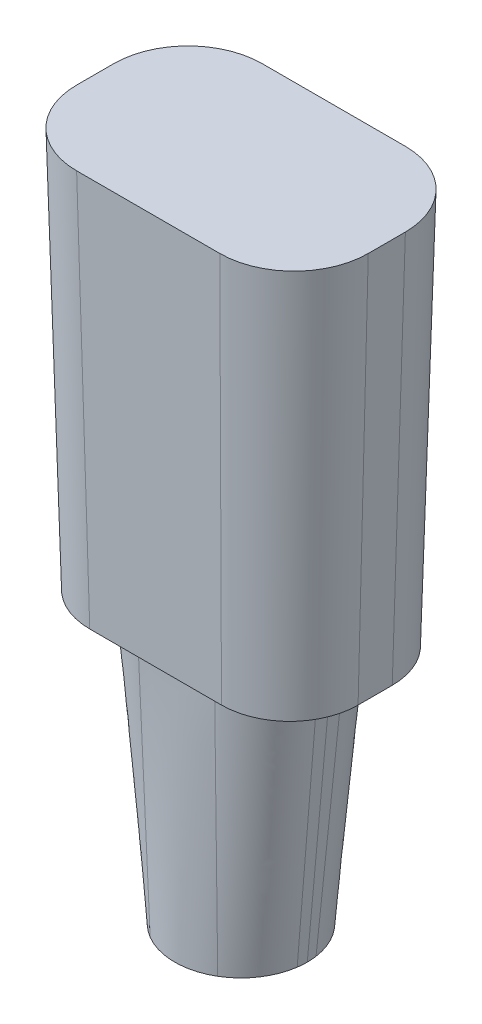
ISO-10303-21;
HEADER;
FILE_DESCRIPTION(('STEP AP214'),'2;1');
FILE_NAME('part.step','',(''),(''),'','','');
FILE_SCHEMA(('AUTOMOTIVE_DESIGN { 1 0 10303 214 1 1 1 1 }'));
ENDSEC;
DATA;
#1=APPLICATION_CONTEXT('core data for automotive mechanical design processes');
#2=APPLICATION_PROTOCOL_DEFINITION('international standard','automotive_design',2000,#1);
#3=PRODUCT_CONTEXT('',#1,'mechanical');
#4=PRODUCT('Part','Part','',(#3));
#5=PRODUCT_RELATED_PRODUCT_CATEGORY('part','',(#4));
#6=PRODUCT_DEFINITION_FORMATION('','',#4);
#7=PRODUCT_DEFINITION_CONTEXT('part definition',#1,'design');
#8=PRODUCT_DEFINITION('design','',#6,#7);
#9=PRODUCT_DEFINITION_SHAPE('','',#8);
#10=(LENGTH_UNIT() NAMED_UNIT(*) SI_UNIT(.MILLI.,.METRE.));
#11=(NAMED_UNIT(*) PLANE_ANGLE_UNIT() SI_UNIT($,.RADIAN.));
#12=(NAMED_UNIT(*) SI_UNIT($,.STERADIAN.) SOLID_ANGLE_UNIT());
#13=UNCERTAINTY_MEASURE_WITH_UNIT(LENGTH_MEASURE(1.E-05),#10,'distance_accuracy_value','');
#14=(GEOMETRIC_REPRESENTATION_CONTEXT(3) GLOBAL_UNCERTAINTY_ASSIGNED_CONTEXT((#13)) GLOBAL_UNIT_ASSIGNED_CONTEXT((#10,
#11,#12)) REPRESENTATION_CONTEXT('',''));
#15=CARTESIAN_POINT('',(0.,0.,0.));
#16=DIRECTION('',(0.,0.,1.));
#17=DIRECTION('',(1.,0.,0.));
#18=AXIS2_PLACEMENT_3D('',#15,#16,#17);
#19=CARTESIAN_POINT('',(-163.,-89.,410.));
#20=DIRECTION('',(0.,-1.,0.));
#21=DIRECTION('',(0.,0.,-1.));
#22=AXIS2_PLACEMENT_3D('',#19,#20,#21);
#23=PLANE('',#22);
#24=CARTESIAN_POINT('',(-163.,-89.,410.));
#25=DIRECTION('',(0.,-1.,0.));
#26=DIRECTION('',(1.,0.,0.));
#27=AXIS2_PLACEMENT_3D('',#24,#25,#26);
#28=CIRCLE('',#27,2.5);
#29=CARTESIAN_POINT('',(-165.4745826264,-89.,410.35558518678));
#30=VERTEX_POINT('',#29);
#31=CARTESIAN_POINT('',(-165.4745826264,-89.,409.64441481321));
#32=VERTEX_POINT('',#31);
#33=EDGE_CURVE('E229',#30,#32,#28,.T.);
#34=ORIENTED_EDGE('',*,*,#33,.T.);
#35=CARTESIAN_POINT('',(-163.,-89.,410.));
#36=DIRECTION('',(0.,-1.,0.));
#37=DIRECTION('',(1.,0.,0.));
#38=AXIS2_PLACEMENT_3D('',#35,#36,#37);
#39=CIRCLE('',#38,2.5);
#40=CARTESIAN_POINT('',(-164.2733022347,-89.,407.84855829294));
#41=VERTEX_POINT('',#40);
#42=EDGE_CURVE('E10',#32,#41,#39,.T.);
#43=ORIENTED_EDGE('',*,*,#42,.T.);
#44=CARTESIAN_POINT('',(-163.,-89.,410.));
#45=DIRECTION('',(0.,-1.,0.));
#46=DIRECTION('',(1.,0.,0.));
#47=AXIS2_PLACEMENT_3D('',#44,#45,#46);
#48=CIRCLE('',#47,2.5);
#49=CARTESIAN_POINT('',(-161.7266977652,-89.,407.84855829294));
#50=VERTEX_POINT('',#49);
#51=EDGE_CURVE('E200',#41,#50,#48,.T.);
#52=ORIENTED_EDGE('',*,*,#51,.T.);
#53=CARTESIAN_POINT('',(-163.,-89.,410.));
#54=DIRECTION('',(0.,-1.,0.));
#55=DIRECTION('',(1.,0.,0.));
#56=AXIS2_PLACEMENT_3D('',#53,#54,#55);
#57=CIRCLE('',#56,2.5);
#58=CARTESIAN_POINT('',(-160.5254173735,-89.,409.64441481321));
#59=VERTEX_POINT('',#58);
#60=EDGE_CURVE('E358',#50,#59,#57,.T.);
#61=ORIENTED_EDGE('',*,*,#60,.T.);
#62=CARTESIAN_POINT('',(-163.,-89.,410.));
#63=DIRECTION('',(0.,-1.,0.));
#64=DIRECTION('',(1.,0.,0.));
#65=AXIS2_PLACEMENT_3D('',#62,#63,#64);
#66=CIRCLE('',#65,2.5);
#67=CARTESIAN_POINT('',(-160.5,-89.,410.));
#68=VERTEX_POINT('',#67);
#69=EDGE_CURVE('E429',#59,#68,#66,.T.);
#70=ORIENTED_EDGE('',*,*,#69,.T.);
#71=CARTESIAN_POINT('',(-163.,-89.,410.));
#72=DIRECTION('',(0.,-1.,0.));
#73=DIRECTION('',(1.,0.,0.));
#74=AXIS2_PLACEMENT_3D('',#71,#72,#73);
#75=CIRCLE('',#74,2.5);
#76=CARTESIAN_POINT('',(-160.5254173735,-89.,410.35558518678));
#77=VERTEX_POINT('',#76);
#78=EDGE_CURVE('E248',#68,#77,#75,.T.);
#79=ORIENTED_EDGE('',*,*,#78,.T.);
#80=CARTESIAN_POINT('',(-163.,-89.,410.));
#81=DIRECTION('',(0.,-1.,0.));
#82=DIRECTION('',(1.,0.,0.));
#83=AXIS2_PLACEMENT_3D('',#80,#81,#82);
#84=CIRCLE('',#83,2.5);
#85=CARTESIAN_POINT('',(-161.7266977652,-89.,412.15144170706));
#86=VERTEX_POINT('',#85);
#87=EDGE_CURVE('E249',#77,#86,#84,.T.);
#88=ORIENTED_EDGE('',*,*,#87,.T.);
#89=CARTESIAN_POINT('',(-163.,-89.,410.));
#90=DIRECTION('',(0.,-1.,0.));
#91=DIRECTION('',(1.,0.,0.));
#92=AXIS2_PLACEMENT_3D('',#89,#90,#91);
#93=CIRCLE('',#92,2.5);
#94=CARTESIAN_POINT('',(-164.2733022347,-89.,412.15144170706));
#95=VERTEX_POINT('',#94);
#96=EDGE_CURVE('E295',#86,#95,#93,.T.);
#97=ORIENTED_EDGE('',*,*,#96,.T.);
#98=CARTESIAN_POINT('',(-163.,-89.,410.));
#99=DIRECTION('',(0.,-1.,0.));
#100=DIRECTION('',(1.,0.,0.));
#101=AXIS2_PLACEMENT_3D('',#98,#99,#100);
#102=CIRCLE('',#101,2.5);
#103=EDGE_CURVE('E309',#95,#30,#102,.T.);
#104=ORIENTED_EDGE('',*,*,#103,.T.);
#105=EDGE_LOOP('',(#34,#43,#52,#61,#70,#79,#88,#97,#104));
#106=FACE_BOUND('',#105,.T.);
#107=ADVANCED_FACE('F15',(#106),#23,.T.);
#108=CARTESIAN_POINT('',(-166.41,-79.,409.51));
#109=CARTESIAN_POINT('',(-165.4745826264,-89.,409.64441481321));
#110=CARTESIAN_POINT('',(-166.41,-79.,409.12515489993));
#111=CARTESIAN_POINT('',(-165.4348600817,-89.,409.36797832885));
#112=CARTESIAN_POINT('',(-166.3236408536,-79.,408.74030967873));
#113=CARTESIAN_POINT('',(-165.3598455751,-89.,409.09661383883));
#114=CARTESIAN_POINT('',(-166.1509234091,-78.99999999999,408.3780740607));
#115=CARTESIAN_POINT('',(-165.2502926811,-89.,408.83557498516));
#116=CARTESIAN_POINT('',(-165.8989471613,-79.,408.06105283867));
#117=CARTESIAN_POINT('',(-165.1078991538,-89.,408.58998873659));
#118=CARTESIAN_POINT('',(-165.5819259392,-78.99999999999,407.80907659089));
#119=CARTESIAN_POINT('',(-164.9352683538,-89.,408.36462873794));
#120=CARTESIAN_POINT('',(-165.2196903212,-79.,407.63635914636));
#121=CARTESIAN_POINT('',(-164.7358186128,-89.,408.1637234854));
#122=CARTESIAN_POINT('',(-164.8348451,-79.,407.55));
#123=CARTESIAN_POINT('',(-164.5136405348,-89.,407.99079932767));
#124=CARTESIAN_POINT('',(-164.45,-79.,407.55));
#125=CARTESIAN_POINT('',(-164.2733022347,-89.,407.84855829294));
#126=(BOUNDED_SURFACE() B_SPLINE_SURFACE(8,1,((#108,#109),(#110,#111),(#112,#113),(#114,#115),
(#116,#117),(#118,#119),(#120,#121),(#122,#123),(#124,#125)),.UNSPECIFIED.,.F.,.F.,
.F.) B_SPLINE_SURFACE_WITH_KNOTS((9,9),(2,2),(3.14159265359,4.712388980385),(0.,1.),
.UNSPECIFIED.) GEOMETRIC_REPRESENTATION_ITEM() RATIONAL_B_SPLINE_SURFACE(((1.,1.),(1.,1.),(1.,
1.),(1.,1.),(1.,1.),(1.,1.),(1.,1.),(1.,1.),(1.,1.))) REPRESENTATION_ITEM('') SURFACE());
#127=CARTESIAN_POINT('',(-164.45,-79.,409.51));
#128=DIRECTION('',(0.,-1.,0.));
#129=DIRECTION('',(1.,0.,0.));
#130=AXIS2_PLACEMENT_3D('',#127,#128,#129);
#131=CIRCLE('',#130,1.96);
#132=CARTESIAN_POINT('',(-166.41,-79.,409.51));
#133=VERTEX_POINT('',#132);
#134=CARTESIAN_POINT('',(-164.45,-79.,407.55));
#135=VERTEX_POINT('',#134);
#136=EDGE_CURVE('E263',#133,#135,#131,.T.);
#137=CARTESIAN_POINT('',(-164.45,-79.,407.55));
#138=CARTESIAN_POINT('',(-164.2733022347,-89.,407.84855829294));
#139=(BOUNDED_CURVE() B_SPLINE_CURVE(1,(#137,#138),.UNSPECIFIED.,.F.,
.F.) B_SPLINE_CURVE_WITH_KNOTS((2,2),(0.,1.),
.UNSPECIFIED.) CURVE() GEOMETRIC_REPRESENTATION_ITEM() RATIONAL_B_SPLINE_CURVE((1.,1.)) REPRESENTATION_ITEM(''));
#140=EDGE_CURVE('E30',#135,#41,#139,.T.);
#141=CARTESIAN_POINT('',(-166.41,-79.,409.51));
#142=CARTESIAN_POINT('',(-165.4745826264,-89.,409.64441481321));
#143=(BOUNDED_CURVE() B_SPLINE_CURVE(1,(#141,#142),.UNSPECIFIED.,.F.,
.F.) B_SPLINE_CURVE_WITH_KNOTS((2,2),(0.,1.),
.UNSPECIFIED.) CURVE() GEOMETRIC_REPRESENTATION_ITEM() RATIONAL_B_SPLINE_CURVE((1.,1.)) REPRESENTATION_ITEM(''));
#144=EDGE_CURVE('E208',#133,#32,#143,.T.);
#145=ORIENTED_EDGE('',*,*,#136,.T.);
#146=ORIENTED_EDGE('',*,*,#140,.T.);
#147=ORIENTED_EDGE('',*,*,#42,.F.);
#148=ORIENTED_EDGE('',*,*,#144,.F.);
#149=EDGE_LOOP('',(#145,#146,#147,#148));
#150=FACE_BOUND('',#149,.T.);
#151=ADVANCED_FACE('F476',(#150),#126,.T.);
#152=CARTESIAN_POINT('',(-164.45,-79.,407.55));
#153=CARTESIAN_POINT('',(-164.2733022347,-89.,407.84855829294));
#154=CARTESIAN_POINT('',(-164.0357142857,-79.,407.55));
#155=CARTESIAN_POINT('',(-163.9448106014,-89.,407.65414487727));
#156=CARTESIAN_POINT('',(-163.6214285714,-79.,407.55));
#157=CARTESIAN_POINT('',(-163.5816877427,-89.,407.51824646727));
#158=CARTESIAN_POINT('',(-163.2071428571,-79.,407.55));
#159=CARTESIAN_POINT('',(-163.1964417629,-89.,407.44826434731));
#160=CARTESIAN_POINT('',(-162.7928571428,-79.,407.55));
#161=CARTESIAN_POINT('',(-162.803558237,-89.,407.44826434731));
#162=CARTESIAN_POINT('',(-162.3785714285,-79.,407.55));
#163=CARTESIAN_POINT('',(-162.4183122572,-89.,407.51824646727));
#164=CARTESIAN_POINT('',(-161.9642857142,-79.,407.55));
#165=CARTESIAN_POINT('',(-162.0551893985,-89.,407.65414487727));
#166=CARTESIAN_POINT('',(-161.55,-79.,407.55));
#167=CARTESIAN_POINT('',(-161.7266977652,-89.,407.84855829294));
#168=(BOUNDED_SURFACE() B_SPLINE_SURFACE(7,1,((#152,#153),(#154,#155),(#156,#157),(#158,#159),
(#160,#161),(#162,#163),(#164,#165),(#166,#167)),.UNSPECIFIED.,.F.,.F.,
.F.) B_SPLINE_SURFACE_WITH_KNOTS((8,8),(2,2),(-1.45,1.45),(0.,1.),
.UNSPECIFIED.) GEOMETRIC_REPRESENTATION_ITEM() RATIONAL_B_SPLINE_SURFACE(((1.,1.),(1.,1.),(1.,
1.),(1.,1.),(1.,1.),(1.,1.),(1.,1.),(1.,1.))) REPRESENTATION_ITEM('') SURFACE());
#169=DIRECTION('',(1.,0.,0.));
#170=VECTOR('',#169,1.);
#171=CARTESIAN_POINT('',(-163.,-79.,407.55));
#172=LINE('',#171,#170);
#173=CARTESIAN_POINT('',(-161.55,-79.,407.55));
#174=VERTEX_POINT('',#173);
#175=EDGE_CURVE('E256',#135,#174,#172,.T.);
#176=CARTESIAN_POINT('',(-161.55,-79.,407.55));
#177=CARTESIAN_POINT('',(-161.7266977652,-89.,407.84855829294));
#178=(BOUNDED_CURVE() B_SPLINE_CURVE(1,(#176,#177),.UNSPECIFIED.,.F.,
.F.) B_SPLINE_CURVE_WITH_KNOTS((2,2),(0.,1.),
.UNSPECIFIED.) CURVE() GEOMETRIC_REPRESENTATION_ITEM() RATIONAL_B_SPLINE_CURVE((1.,1.)) REPRESENTATION_ITEM(''));
#179=EDGE_CURVE('E202',#174,#50,#178,.T.);
#180=ORIENTED_EDGE('',*,*,#175,.T.);
#181=ORIENTED_EDGE('',*,*,#179,.T.);
#182=ORIENTED_EDGE('',*,*,#51,.F.);
#183=ORIENTED_EDGE('',*,*,#140,.F.);
#184=EDGE_LOOP('',(#180,#181,#182,#183));
#185=FACE_BOUND('',#184,.T.);
#186=ADVANCED_FACE('F474',(#185),#168,.T.);
#187=CARTESIAN_POINT('',(-161.55,-79.,407.55));
#188=CARTESIAN_POINT('',(-161.7266977652,-89.,407.84855829294));
#189=CARTESIAN_POINT('',(-161.1651548999,-79.,407.55));
#190=CARTESIAN_POINT('',(-161.4863594651,-89.,407.99079932767));
#191=CARTESIAN_POINT('',(-160.7803096787,-79.,407.63635914636));
#192=CARTESIAN_POINT('',(-161.2641813871,-89.,408.1637234854));
#193=CARTESIAN_POINT('',(-160.4180740607,-78.99999999999,407.80907659089));
#194=CARTESIAN_POINT('',(-161.0647316461,-89.,408.36462873794));
#195=CARTESIAN_POINT('',(-160.1010528386,-79.,408.06105283867));
#196=CARTESIAN_POINT('',(-160.8921008461,-89.,408.58998873659));
#197=CARTESIAN_POINT('',(-159.8490765908,-78.99999999999,408.3780740607));
#198=CARTESIAN_POINT('',(-160.7497073188,-89.,408.83557498516));
#199=CARTESIAN_POINT('',(-159.6763591463,-79.,408.74030967873));
#200=CARTESIAN_POINT('',(-160.6401544248,-89.,409.09661383883));
#201=CARTESIAN_POINT('',(-159.59,-79.,409.12515489993));
#202=CARTESIAN_POINT('',(-160.5651399182,-89.,409.36797832885));
#203=CARTESIAN_POINT('',(-159.59,-79.,409.51));
#204=CARTESIAN_POINT('',(-160.5254173735,-89.,409.64441481321));
#205=(BOUNDED_SURFACE() B_SPLINE_SURFACE(8,1,((#187,#188),(#189,#190),(#191,#192),(#193,#194),
(#195,#196),(#197,#198),(#199,#200),(#201,#202),(#203,#204)),.UNSPECIFIED.,.F.,.F.,
.F.) B_SPLINE_SURFACE_WITH_KNOTS((9,9),(2,2),(4.712388980385,6.28318530718),(0.,1.),
.UNSPECIFIED.) GEOMETRIC_REPRESENTATION_ITEM() RATIONAL_B_SPLINE_SURFACE(((1.,1.),(1.,1.),(1.,
1.),(1.,1.),(1.,1.),(1.,1.),(1.,1.),(1.,1.),(1.,1.))) REPRESENTATION_ITEM('') SURFACE());
#206=CARTESIAN_POINT('',(-161.55,-79.,409.51));
#207=DIRECTION('',(0.,-1.,0.));
#208=DIRECTION('',(1.,0.,0.));
#209=AXIS2_PLACEMENT_3D('',#206,#207,#208);
#210=CIRCLE('',#209,1.96);
#211=CARTESIAN_POINT('',(-159.59,-79.,409.51));
#212=VERTEX_POINT('',#211);
#213=EDGE_CURVE('E264',#174,#212,#210,.T.);
#214=CARTESIAN_POINT('',(-159.59,-79.,409.51));
#215=CARTESIAN_POINT('',(-160.5254173735,-89.,409.64441481321));
#216=(BOUNDED_CURVE() B_SPLINE_CURVE(1,(#214,#215),.UNSPECIFIED.,.F.,
.F.) B_SPLINE_CURVE_WITH_KNOTS((2,2),(0.,1.),
.UNSPECIFIED.) CURVE() GEOMETRIC_REPRESENTATION_ITEM() RATIONAL_B_SPLINE_CURVE((1.,1.)) REPRESENTATION_ITEM(''));
#217=EDGE_CURVE('E362',#212,#59,#216,.T.);
#218=ORIENTED_EDGE('',*,*,#213,.T.);
#219=ORIENTED_EDGE('',*,*,#217,.T.);
#220=ORIENTED_EDGE('',*,*,#60,.F.);
#221=ORIENTED_EDGE('',*,*,#179,.F.);
#222=EDGE_LOOP('',(#218,#219,#220,#221));
#223=FACE_BOUND('',#222,.T.);
#224=ADVANCED_FACE('F469',(#223),#205,.T.);
#225=CARTESIAN_POINT('',(-159.59,-79.,409.51));
#226=CARTESIAN_POINT('',(-160.5254173735,-89.,409.64441481321));
#227=CARTESIAN_POINT('',(-159.59,-79.,409.6325));
#228=CARTESIAN_POINT('',(-160.5127302654,-89.,409.73270672887));
#229=CARTESIAN_POINT('',(-159.59,-79.,409.755));
#230=CARTESIAN_POINT('',(-160.5042434329,-89.,409.82160230682));
#231=CARTESIAN_POINT('',(-159.59,-79.,409.8775));
#232=CARTESIAN_POINT('',(-160.5,-89.,409.91080120469));
#233=CARTESIAN_POINT('',(-159.59,-79.,410.));
#234=CARTESIAN_POINT('',(-160.5,-89.,410.));
#235=(BOUNDED_SURFACE() B_SPLINE_SURFACE(4,1,((#225,#226),(#227,#228),(#229,#230),(#231,#232),
(#233,#234)),.UNSPECIFIED.,.F.,.F.,.F.) B_SPLINE_SURFACE_WITH_KNOTS((5,5),(2,2),(-0.49,0.),(0.,
1.),.UNSPECIFIED.) GEOMETRIC_REPRESENTATION_ITEM() RATIONAL_B_SPLINE_SURFACE(((1.,1.),(1.,1.),
(1.,1.),(1.,1.),(1.,1.))) REPRESENTATION_ITEM('') SURFACE());
#236=DIRECTION('',(0.,0.,1.));
#237=VECTOR('',#236,1.);
#238=CARTESIAN_POINT('',(-159.59,-79.,410.));
#239=LINE('',#238,#237);
#240=CARTESIAN_POINT('',(-159.59,-79.,410.));
#241=VERTEX_POINT('',#240);
#242=EDGE_CURVE('E291',#212,#241,#239,.T.);
#243=CARTESIAN_POINT('',(-159.59,-79.,410.));
#244=CARTESIAN_POINT('',(-160.5,-89.,410.));
#245=(BOUNDED_CURVE() B_SPLINE_CURVE(1,(#243,#244),.UNSPECIFIED.,.F.,
.F.) B_SPLINE_CURVE_WITH_KNOTS((2,2),(0.,1.),
.UNSPECIFIED.) CURVE() GEOMETRIC_REPRESENTATION_ITEM() RATIONAL_B_SPLINE_CURVE((1.,1.)) REPRESENTATION_ITEM(''));
#246=EDGE_CURVE('E21',#241,#68,#245,.T.);
#247=ORIENTED_EDGE('',*,*,#242,.T.);
#248=ORIENTED_EDGE('',*,*,#246,.T.);
#249=ORIENTED_EDGE('',*,*,#69,.F.);
#250=ORIENTED_EDGE('',*,*,#217,.F.);
#251=EDGE_LOOP('',(#247,#248,#249,#250));
#252=FACE_BOUND('',#251,.T.);
#253=ADVANCED_FACE('F467',(#252),#235,.T.);
#254=CARTESIAN_POINT('',(-159.59,-79.,410.));
#255=CARTESIAN_POINT('',(-160.5,-89.,410.));
#256=CARTESIAN_POINT('',(-159.59,-79.,410.1225));
#257=CARTESIAN_POINT('',(-160.5,-89.,410.0891987953));
#258=CARTESIAN_POINT('',(-159.59,-79.,410.245));
#259=CARTESIAN_POINT('',(-160.5042434329,-89.,410.17839769317));
#260=CARTESIAN_POINT('',(-159.59,-79.,410.3675));
#261=CARTESIAN_POINT('',(-160.5127302654,-89.,410.26729327112));
#262=CARTESIAN_POINT('',(-159.59,-79.,410.49));
#263=CARTESIAN_POINT('',(-160.5254173735,-89.,410.35558518678));
#264=(BOUNDED_SURFACE() B_SPLINE_SURFACE(4,1,((#254,#255),(#256,#257),(#258,#259),(#260,#261),
(#262,#263)),.UNSPECIFIED.,.F.,.F.,.F.) B_SPLINE_SURFACE_WITH_KNOTS((5,5),(2,2),(0.,0.49),(0.,
1.),.UNSPECIFIED.) GEOMETRIC_REPRESENTATION_ITEM() RATIONAL_B_SPLINE_SURFACE(((1.,1.),(1.,1.),
(1.,1.),(1.,1.),(1.,1.))) REPRESENTATION_ITEM('') SURFACE());
#265=DIRECTION('',(0.,0.,1.));
#266=VECTOR('',#265,1.);
#267=CARTESIAN_POINT('',(-159.59,-79.,410.));
#268=LINE('',#267,#266);
#269=CARTESIAN_POINT('',(-159.59,-79.,410.49));
#270=VERTEX_POINT('',#269);
#271=EDGE_CURVE('E279',#241,#270,#268,.T.);
#272=CARTESIAN_POINT('',(-159.59,-79.,410.49));
#273=CARTESIAN_POINT('',(-160.5254173735,-89.,410.35558518678));
#274=(BOUNDED_CURVE() B_SPLINE_CURVE(1,(#272,#273),.UNSPECIFIED.,.F.,
.F.) B_SPLINE_CURVE_WITH_KNOTS((2,2),(0.,1.),
.UNSPECIFIED.) CURVE() GEOMETRIC_REPRESENTATION_ITEM() RATIONAL_B_SPLINE_CURVE((1.,1.)) REPRESENTATION_ITEM(''));
#275=EDGE_CURVE('E243',#270,#77,#274,.T.);
#276=ORIENTED_EDGE('',*,*,#271,.T.);
#277=ORIENTED_EDGE('',*,*,#275,.T.);
#278=ORIENTED_EDGE('',*,*,#78,.F.);
#279=ORIENTED_EDGE('',*,*,#246,.F.);
#280=EDGE_LOOP('',(#276,#277,#278,#279));
#281=FACE_BOUND('',#280,.T.);
#282=ADVANCED_FACE('F17',(#281),#264,.T.);
#283=CARTESIAN_POINT('',(-159.59,-79.,410.49));
#284=CARTESIAN_POINT('',(-160.5254173735,-89.,410.35558518678));
#285=CARTESIAN_POINT('',(-159.59,-79.,410.87484510006));
#286=CARTESIAN_POINT('',(-160.5651399182,-89.,410.63202167114));
#287=CARTESIAN_POINT('',(-159.6763591463,-79.,411.25969032126));
#288=CARTESIAN_POINT('',(-160.6401544248,-89.,410.90338616117));
#289=CARTESIAN_POINT('',(-159.8490765908,-79.,411.62192593929));
#290=CARTESIAN_POINT('',(-160.7497073188,-89.,411.16442501483));
#291=CARTESIAN_POINT('',(-160.1010528386,-79.,411.93894716132));
#292=CARTESIAN_POINT('',(-160.8921008461,-89.,411.4100112634));
#293=CARTESIAN_POINT('',(-160.4180740607,-79.,412.1909234091));
#294=CARTESIAN_POINT('',(-161.0647316461,-89.,411.63537126205));
#295=CARTESIAN_POINT('',(-160.7803096787,-79.,412.36364085363));
#296=CARTESIAN_POINT('',(-161.2641813871,-89.,411.83627651459));
#297=CARTESIAN_POINT('',(-161.1651548999,-79.,412.45));
#298=CARTESIAN_POINT('',(-161.4863594651,-89.,412.00920067232));
#299=CARTESIAN_POINT('',(-161.55,-79.,412.45));
#300=CARTESIAN_POINT('',(-161.7266977652,-89.,412.15144170706));
#301=(BOUNDED_SURFACE() B_SPLINE_SURFACE(8,1,((#283,#284),(#285,#286),(#287,#288),(#289,#290),
(#291,#292),(#293,#294),(#295,#296),(#297,#298),(#299,#300)),.UNSPECIFIED.,.F.,.F.,
.F.) B_SPLINE_SURFACE_WITH_KNOTS((9,9),(2,2),(0.,1.570796326795),(0.,1.),
.UNSPECIFIED.) GEOMETRIC_REPRESENTATION_ITEM() RATIONAL_B_SPLINE_SURFACE(((1.,1.),(1.,1.),(1.,
1.),(1.,1.),(1.,1.),(1.,1.),(1.,1.),(1.,1.),(1.,1.))) REPRESENTATION_ITEM('') SURFACE());
#302=CARTESIAN_POINT('',(-161.55,-79.,410.49));
#303=DIRECTION('',(0.,-1.,0.));
#304=DIRECTION('',(1.,0.,0.));
#305=AXIS2_PLACEMENT_3D('',#302,#303,#304);
#306=CIRCLE('',#305,1.96);
#307=CARTESIAN_POINT('',(-161.55,-79.,412.45));
#308=VERTEX_POINT('',#307);
#309=EDGE_CURVE('E275',#270,#308,#306,.T.);
#310=CARTESIAN_POINT('',(-161.55,-79.,412.45));
#311=CARTESIAN_POINT('',(-161.7266977652,-89.,412.15144170706));
#312=(BOUNDED_CURVE() B_SPLINE_CURVE(1,(#310,#311),.UNSPECIFIED.,.F.,
.F.) B_SPLINE_CURVE_WITH_KNOTS((2,2),(0.,1.),
.UNSPECIFIED.) CURVE() GEOMETRIC_REPRESENTATION_ITEM() RATIONAL_B_SPLINE_CURVE((1.,1.)) REPRESENTATION_ITEM(''));
#313=EDGE_CURVE('E298',#308,#86,#312,.T.);
#314=ORIENTED_EDGE('',*,*,#309,.T.);
#315=ORIENTED_EDGE('',*,*,#313,.T.);
#316=ORIENTED_EDGE('',*,*,#87,.F.);
#317=ORIENTED_EDGE('',*,*,#275,.F.);
#318=EDGE_LOOP('',(#314,#315,#316,#317));
#319=FACE_BOUND('',#318,.T.);
#320=ADVANCED_FACE('F460',(#319),#301,.T.);
#321=CARTESIAN_POINT('',(-161.55,-79.,412.45));
#322=CARTESIAN_POINT('',(-161.7266977652,-89.,412.15144170706));
#323=CARTESIAN_POINT('',(-161.9642857142,-79.,412.45));
#324=CARTESIAN_POINT('',(-162.0551893985,-89.,412.34585512272));
#325=CARTESIAN_POINT('',(-162.3785714285,-79.,412.45));
#326=CARTESIAN_POINT('',(-162.4183122572,-89.,412.48175353272));
#327=CARTESIAN_POINT('',(-162.7928571428,-79.,412.45));
#328=CARTESIAN_POINT('',(-162.803558237,-89.,412.55173565268));
#329=CARTESIAN_POINT('',(-163.2071428571,-79.,412.45));
#330=CARTESIAN_POINT('',(-163.1964417629,-89.,412.55173565268));
#331=CARTESIAN_POINT('',(-163.6214285714,-79.,412.45));
#332=CARTESIAN_POINT('',(-163.5816877427,-89.,412.48175353272));
#333=CARTESIAN_POINT('',(-164.0357142857,-79.,412.45));
#334=CARTESIAN_POINT('',(-163.9448106014,-89.,412.34585512272));
#335=CARTESIAN_POINT('',(-164.45,-79.,412.45));
#336=CARTESIAN_POINT('',(-164.2733022347,-89.,412.15144170706));
#337=(BOUNDED_SURFACE() B_SPLINE_SURFACE(7,1,((#321,#322),(#323,#324),(#325,#326),(#327,#328),
(#329,#330),(#331,#332),(#333,#334),(#335,#336)),.UNSPECIFIED.,.F.,.F.,
.F.) B_SPLINE_SURFACE_WITH_KNOTS((8,8),(2,2),(-1.45,1.45),(0.,1.),
.UNSPECIFIED.) GEOMETRIC_REPRESENTATION_ITEM() RATIONAL_B_SPLINE_SURFACE(((1.,1.),(1.,1.),(1.,
1.),(1.,1.),(1.,1.),(1.,1.),(1.,1.),(1.,1.))) REPRESENTATION_ITEM('') SURFACE());
#338=DIRECTION('',(1.,0.,0.));
#339=VECTOR('',#338,1.);
#340=CARTESIAN_POINT('',(-163.,-79.,412.45));
#341=LINE('',#340,#339);
#342=CARTESIAN_POINT('',(-164.45,-79.,412.45));
#343=VERTEX_POINT('',#342);
#344=EDGE_CURVE('E280',#343,#308,#341,.T.);
#345=CARTESIAN_POINT('',(-164.45,-79.,412.45));
#346=CARTESIAN_POINT('',(-164.2733022347,-89.,412.15144170706));
#347=(BOUNDED_CURVE() B_SPLINE_CURVE(1,(#345,#346),.UNSPECIFIED.,.F.,
.F.) B_SPLINE_CURVE_WITH_KNOTS((2,2),(0.,1.),
.UNSPECIFIED.) CURVE() GEOMETRIC_REPRESENTATION_ITEM() RATIONAL_B_SPLINE_CURVE((1.,1.)) REPRESENTATION_ITEM(''));
#348=EDGE_CURVE('E299',#343,#95,#347,.T.);
#349=ORIENTED_EDGE('',*,*,#344,.F.);
#350=ORIENTED_EDGE('',*,*,#348,.T.);
#351=ORIENTED_EDGE('',*,*,#96,.F.);
#352=ORIENTED_EDGE('',*,*,#313,.F.);
#353=EDGE_LOOP('',(#349,#350,#351,#352));
#354=FACE_BOUND('',#353,.T.);
#355=ADVANCED_FACE('F456',(#354),#337,.T.);
#356=CARTESIAN_POINT('',(-164.45,-79.,412.45));
#357=CARTESIAN_POINT('',(-164.2733022347,-89.,412.15144170706));
#358=CARTESIAN_POINT('',(-164.8348451,-79.,412.45));
#359=CARTESIAN_POINT('',(-164.5136405348,-89.,412.00920067232));
#360=CARTESIAN_POINT('',(-165.2196903212,-79.,412.36364085363));
#361=CARTESIAN_POINT('',(-164.7358186128,-89.,411.83627651459));
#362=CARTESIAN_POINT('',(-165.5819259392,-78.99999999999,412.1909234091));
#363=CARTESIAN_POINT('',(-164.9352683538,-89.,411.63537126205));
#364=CARTESIAN_POINT('',(-165.8989471613,-79.,411.93894716132));
#365=CARTESIAN_POINT('',(-165.1078991538,-89.,411.4100112634));
#366=CARTESIAN_POINT('',(-166.1509234091,-78.99999999999,411.62192593929));
#367=CARTESIAN_POINT('',(-165.2502926811,-89.,411.16442501483));
#368=CARTESIAN_POINT('',(-166.3236408536,-79.,411.25969032126));
#369=CARTESIAN_POINT('',(-165.3598455751,-89.,410.90338616117));
#370=CARTESIAN_POINT('',(-166.41,-79.,410.87484510006));
#371=CARTESIAN_POINT('',(-165.4348600817,-89.,410.63202167114));
#372=CARTESIAN_POINT('',(-166.41,-79.,410.49));
#373=CARTESIAN_POINT('',(-165.4745826264,-89.,410.35558518678));
#374=(BOUNDED_SURFACE() B_SPLINE_SURFACE(8,1,((#356,#357),(#358,#359),(#360,#361),(#362,#363),
(#364,#365),(#366,#367),(#368,#369),(#370,#371),(#372,#373)),.UNSPECIFIED.,.F.,.F.,
.F.) B_SPLINE_SURFACE_WITH_KNOTS((9,9),(2,2),(1.570796326795,3.14159265359),(0.,1.),
.UNSPECIFIED.) GEOMETRIC_REPRESENTATION_ITEM() RATIONAL_B_SPLINE_SURFACE(((1.,1.),(1.,1.),(1.,
1.),(1.,1.),(1.,1.),(1.,1.),(1.,1.),(1.,1.),(1.,1.))) REPRESENTATION_ITEM('') SURFACE());
#375=CARTESIAN_POINT('',(-164.45,-79.,410.49));
#376=DIRECTION('',(0.,-1.,0.));
#377=DIRECTION('',(1.,0.,0.));
#378=AXIS2_PLACEMENT_3D('',#375,#376,#377);
#379=CIRCLE('',#378,1.96);
#380=CARTESIAN_POINT('',(-166.41,-79.,410.49));
#381=VERTEX_POINT('',#380);
#382=EDGE_CURVE('E237',#343,#381,#379,.T.);
#383=CARTESIAN_POINT('',(-166.41,-79.,410.49));
#384=CARTESIAN_POINT('',(-165.4745826264,-89.,410.35558518678));
#385=(BOUNDED_CURVE() B_SPLINE_CURVE(1,(#383,#384),.UNSPECIFIED.,.F.,
.F.) B_SPLINE_CURVE_WITH_KNOTS((2,2),(0.,1.),
.UNSPECIFIED.) CURVE() GEOMETRIC_REPRESENTATION_ITEM() RATIONAL_B_SPLINE_CURVE((1.,1.)) REPRESENTATION_ITEM(''));
#386=EDGE_CURVE('E271',#381,#30,#385,.T.);
#387=ORIENTED_EDGE('',*,*,#382,.T.);
#388=ORIENTED_EDGE('',*,*,#386,.T.);
#389=ORIENTED_EDGE('',*,*,#103,.F.);
#390=ORIENTED_EDGE('',*,*,#348,.F.);
#391=EDGE_LOOP('',(#387,#388,#389,#390));
#392=FACE_BOUND('',#391,.T.);
#393=ADVANCED_FACE('F448',(#392),#374,.T.);
#394=CARTESIAN_POINT('',(-166.41,-79.,410.49));
#395=CARTESIAN_POINT('',(-165.4745826264,-89.,410.35558518678));
#396=CARTESIAN_POINT('',(-166.41,-79.,410.294));
#397=CARTESIAN_POINT('',(-165.4948819993,-89.,410.21431812173));
#398=CARTESIAN_POINT('',(-166.41,-79.,410.098));
#399=CARTESIAN_POINT('',(-165.5051007333,-89.,410.07160251371));
#400=CARTESIAN_POINT('',(-166.41,-79.,409.902));
#401=CARTESIAN_POINT('',(-165.5051007333,-89.,409.92839748628));
#402=CARTESIAN_POINT('',(-166.41,-79.,409.706));
#403=CARTESIAN_POINT('',(-165.4948819993,-89.,409.78568187826));
#404=CARTESIAN_POINT('',(-166.41,-79.,409.51));
#405=CARTESIAN_POINT('',(-165.4745826264,-89.,409.64441481321));
#406=(BOUNDED_SURFACE() B_SPLINE_SURFACE(5,1,((#394,#395),(#396,#397),(#398,#399),(#400,#401),
(#402,#403),(#404,#405)),.UNSPECIFIED.,.F.,.F.,.F.) B_SPLINE_SURFACE_WITH_KNOTS((6,6),(2,2),
(-0.49,0.49),(0.,1.),
.UNSPECIFIED.) GEOMETRIC_REPRESENTATION_ITEM() RATIONAL_B_SPLINE_SURFACE(((1.,1.),(1.,1.),(1.,
1.),(1.,1.),(1.,1.),(1.,1.))) REPRESENTATION_ITEM('') SURFACE());
#407=DIRECTION('',(0.,0.,1.));
#408=VECTOR('',#407,1.);
#409=CARTESIAN_POINT('',(-166.41,-79.,410.));
#410=LINE('',#409,#408);
#411=EDGE_CURVE('E357',#133,#381,#410,.T.);
#412=ORIENTED_EDGE('',*,*,#411,.F.);
#413=ORIENTED_EDGE('',*,*,#144,.T.);
#414=ORIENTED_EDGE('',*,*,#33,.F.);
#415=ORIENTED_EDGE('',*,*,#386,.F.);
#416=EDGE_LOOP('',(#412,#413,#414,#415));
#417=FACE_BOUND('',#416,.T.);
#418=ADVANCED_FACE('F478',(#417),#406,.T.);
#419=CARTESIAN_POINT('',(-160.3,-64.,413.5));
#420=CARTESIAN_POINT('',(-160.516,-79.,413.22));
#421=CARTESIAN_POINT('',(-165.7,-64.,413.5));
#422=CARTESIAN_POINT('',(-165.484,-79.,413.22));
#423=(BOUNDED_SURFACE() B_SPLINE_SURFACE(1,1,((#419,#420),(#421,#422)),.UNSPECIFIED.,.F.,.F.,
.F.) B_SPLINE_SURFACE_WITH_KNOTS((2,2),(2,2),(-2.7,2.7),(0.,1.),
.UNSPECIFIED.) GEOMETRIC_REPRESENTATION_ITEM() RATIONAL_B_SPLINE_SURFACE(((1.,1.),(1.,1.))) REPRESENTATION_ITEM('') SURFACE());
#424=DIRECTION('',(1.,0.,0.));
#425=VECTOR('',#424,1.);
#426=CARTESIAN_POINT('',(-163.,-64.,413.5));
#427=LINE('',#426,#425);
#428=CARTESIAN_POINT('',(-165.7,-64.,413.5));
#429=VERTEX_POINT('',#428);
#430=CARTESIAN_POINT('',(-160.3,-64.,413.5));
#431=VERTEX_POINT('',#430);
#432=EDGE_CURVE('E274',#429,#431,#427,.T.);
#433=CARTESIAN_POINT('',(-165.7,-64.,413.5));
#434=CARTESIAN_POINT('',(-165.484,-79.,413.22));
#435=(BOUNDED_CURVE() B_SPLINE_CURVE(1,(#433,#434),.UNSPECIFIED.,.F.,
.F.) B_SPLINE_CURVE_WITH_KNOTS((2,2),(0.,1.),
.UNSPECIFIED.) CURVE() GEOMETRIC_REPRESENTATION_ITEM() RATIONAL_B_SPLINE_CURVE((1.,1.)) REPRESENTATION_ITEM(''));
#436=CARTESIAN_POINT('',(-165.484,-79.,413.22));
#437=VERTEX_POINT('',#436);
#438=EDGE_CURVE('E174',#429,#437,#435,.T.);
#439=DIRECTION('',(1.,0.,0.));
#440=VECTOR('',#439,1.);
#441=CARTESIAN_POINT('',(-163.,-79.,413.22));
#442=LINE('',#441,#440);
#443=CARTESIAN_POINT('',(-160.516,-79.,413.22));
#444=VERTEX_POINT('',#443);
#445=EDGE_CURVE('E238',#437,#444,#442,.T.);
#446=CARTESIAN_POINT('',(-160.3,-64.,413.5));
#447=CARTESIAN_POINT('',(-160.516,-79.,413.22));
#448=(BOUNDED_CURVE() B_SPLINE_CURVE(1,(#446,#447),.UNSPECIFIED.,.F.,
.F.) B_SPLINE_CURVE_WITH_KNOTS((2,2),(0.,1.),
.UNSPECIFIED.) CURVE() GEOMETRIC_REPRESENTATION_ITEM() RATIONAL_B_SPLINE_CURVE((1.,1.)) REPRESENTATION_ITEM(''));
#449=EDGE_CURVE('E203',#431,#444,#448,.T.);
#450=ORIENTED_EDGE('',*,*,#432,.F.);
#451=ORIENTED_EDGE('',*,*,#438,.T.);
#452=ORIENTED_EDGE('',*,*,#445,.T.);
#453=ORIENTED_EDGE('',*,*,#449,.F.);
#454=EDGE_LOOP('',(#450,#451,#452,#453));
#455=FACE_BOUND('',#454,.T.);
#456=ADVANCED_FACE('F519',(#455),#423,.T.);
#457=CARTESIAN_POINT('',(-157.5,-64.,410.7));
#458=CARTESIAN_POINT('',(-157.94,-79.,410.644));
#459=CARTESIAN_POINT('',(-157.5,-64.,411.24977871437));
#460=CARTESIAN_POINT('',(-157.94,-79.,411.14979641722));
#461=CARTESIAN_POINT('',(-157.623370209,-64.,411.79955760181));
#462=CARTESIAN_POINT('',(-158.0535005923,-79.,411.65559299366));
#463=CARTESIAN_POINT('',(-157.8701094155,-64.,412.31703705613));
#464=CARTESIAN_POINT('',(-158.2805006623,-78.99999999999,412.13167409164));
#465=CARTESIAN_POINT('',(-158.2300754838,-64.,412.76992451618));
#466=CARTESIAN_POINT('',(-158.6116694451,-79.,412.54833055488));
#467=CARTESIAN_POINT('',(-158.6829629438,-64.,413.12989058444));
#468=CARTESIAN_POINT('',(-159.0283259083,-78.99999999999,412.87949933768));
#469=CARTESIAN_POINT('',(-159.2004423981,-64.,413.3766297909));
#470=CARTESIAN_POINT('',(-159.5044070063,-79.,413.10649940763));
#471=CARTESIAN_POINT('',(-159.7502212856,-64.,413.5));
#472=CARTESIAN_POINT('',(-160.0102035827,-79.,413.22));
#473=CARTESIAN_POINT('',(-160.3,-64.,413.5));
#474=CARTESIAN_POINT('',(-160.516,-79.,413.22));
#475=(BOUNDED_SURFACE() B_SPLINE_SURFACE(8,1,((#457,#458),(#459,#460),(#461,#462),(#463,#464),
(#465,#466),(#467,#468),(#469,#470),(#471,#472),(#473,#474)),.UNSPECIFIED.,.F.,.F.,
.F.) B_SPLINE_SURFACE_WITH_KNOTS((9,9),(2,2),(3.14159265359,4.712388980385),(0.,1.),
.UNSPECIFIED.) GEOMETRIC_REPRESENTATION_ITEM() RATIONAL_B_SPLINE_SURFACE(((1.,1.),(1.,1.),(1.,
1.),(1.,1.),(1.,1.),(1.,1.),(1.,1.),(1.,1.),(1.,1.))) REPRESENTATION_ITEM('') SURFACE());
#476=CARTESIAN_POINT('',(-160.3,-64.,410.7));
#477=DIRECTION('',(0.,1.,0.));
#478=DIRECTION('',(-1.,0.,0.));
#479=AXIS2_PLACEMENT_3D('',#476,#477,#478);
#480=CIRCLE('',#479,2.8);
#481=CARTESIAN_POINT('',(-157.5,-64.,410.7));
#482=VERTEX_POINT('',#481);
#483=EDGE_CURVE('E195',#431,#482,#480,.T.);
#484=CARTESIAN_POINT('',(-160.516,-79.,410.644));
#485=DIRECTION('',(0.,1.,0.));
#486=DIRECTION('',(-1.,0.,0.));
#487=AXIS2_PLACEMENT_3D('',#484,#485,#486);
#488=CIRCLE('',#487,2.576);
#489=CARTESIAN_POINT('',(-157.94,-79.,410.644));
#490=VERTEX_POINT('',#489);
#491=EDGE_CURVE('E242',#444,#490,#488,.T.);
#492=CARTESIAN_POINT('',(-157.5,-64.,410.7));
#493=CARTESIAN_POINT('',(-157.94,-79.,410.644));
#494=(BOUNDED_CURVE() B_SPLINE_CURVE(1,(#492,#493),.UNSPECIFIED.,.F.,
.F.) B_SPLINE_CURVE_WITH_KNOTS((2,2),(0.,1.),
.UNSPECIFIED.) CURVE() GEOMETRIC_REPRESENTATION_ITEM() RATIONAL_B_SPLINE_CURVE((1.,1.)) REPRESENTATION_ITEM(''));
#495=EDGE_CURVE('E209',#482,#490,#494,.T.);
#496=ORIENTED_EDGE('',*,*,#483,.F.);
#497=ORIENTED_EDGE('',*,*,#449,.T.);
#498=ORIENTED_EDGE('',*,*,#491,.T.);
#499=ORIENTED_EDGE('',*,*,#495,.F.);
#500=EDGE_LOOP('',(#496,#497,#498,#499));
#501=FACE_BOUND('',#500,.T.);
#502=ADVANCED_FACE('F507',(#501),#475,.T.);
#503=CARTESIAN_POINT('',(-157.5,-64.,409.3));
#504=CARTESIAN_POINT('',(-157.94,-79.,409.356));
#505=CARTESIAN_POINT('',(-157.5,-64.,410.7));
#506=CARTESIAN_POINT('',(-157.94,-79.,410.644));
#507=(BOUNDED_SURFACE() B_SPLINE_SURFACE(1,1,((#503,#504),(#505,#506)),.UNSPECIFIED.,.F.,.F.,
.F.) B_SPLINE_SURFACE_WITH_KNOTS((2,2),(2,2),(-0.7,0.7),(0.,1.),
.UNSPECIFIED.) GEOMETRIC_REPRESENTATION_ITEM() RATIONAL_B_SPLINE_SURFACE(((1.,1.),(1.,1.))) REPRESENTATION_ITEM('') SURFACE());
#508=DIRECTION('',(0.,0.,1.));
#509=VECTOR('',#508,1.);
#510=CARTESIAN_POINT('',(-157.5,-64.,410.));
#511=LINE('',#510,#509);
#512=CARTESIAN_POINT('',(-157.5,-64.,409.3));
#513=VERTEX_POINT('',#512);
#514=EDGE_CURVE('E188',#513,#482,#511,.T.);
#515=DIRECTION('',(0.,0.,1.));
#516=VECTOR('',#515,1.);
#517=CARTESIAN_POINT('',(-157.94,-79.,410.));
#518=LINE('',#517,#516);
#519=CARTESIAN_POINT('',(-157.94,-79.,409.356));
#520=VERTEX_POINT('',#519);
#521=EDGE_CURVE('E300',#520,#490,#518,.T.);
#522=CARTESIAN_POINT('',(-157.5,-64.,409.3));
#523=CARTESIAN_POINT('',(-157.94,-79.,409.356));
#524=(BOUNDED_CURVE() B_SPLINE_CURVE(1,(#522,#523),.UNSPECIFIED.,.F.,
.F.) B_SPLINE_CURVE_WITH_KNOTS((2,2),(0.,1.),
.UNSPECIFIED.) CURVE() GEOMETRIC_REPRESENTATION_ITEM() RATIONAL_B_SPLINE_CURVE((1.,1.)) REPRESENTATION_ITEM(''));
#525=EDGE_CURVE('E173',#513,#520,#524,.T.);
#526=ORIENTED_EDGE('',*,*,#514,.T.);
#527=ORIENTED_EDGE('',*,*,#495,.T.);
#528=ORIENTED_EDGE('',*,*,#521,.F.);
#529=ORIENTED_EDGE('',*,*,#525,.F.);
#530=EDGE_LOOP('',(#526,#527,#528,#529));
#531=FACE_BOUND('',#530,.T.);
#532=ADVANCED_FACE('F510',(#531),#507,.T.);
#533=CARTESIAN_POINT('',(-160.3,-64.,406.5));
#534=CARTESIAN_POINT('',(-160.516,-79.,406.78));
#535=CARTESIAN_POINT('',(-159.7502212856,-64.,406.5));
#536=CARTESIAN_POINT('',(-160.0102035827,-79.,406.78));
#537=CARTESIAN_POINT('',(-159.2004423981,-64.,406.62337020909));
#538=CARTESIAN_POINT('',(-159.5044070063,-79.,406.89350059236));
#539=CARTESIAN_POINT('',(-158.6829629438,-64.,406.87010941556));
#540=CARTESIAN_POINT('',(-159.0283259083,-78.99999999999,407.12050066231));
#541=CARTESIAN_POINT('',(-158.2300754838,-64.,407.23007548381));
#542=CARTESIAN_POINT('',(-158.6116694451,-79.,407.45166944511));
#543=CARTESIAN_POINT('',(-157.8701094155,-64.,407.68296294386));
#544=CARTESIAN_POINT('',(-158.2805006623,-78.99999999999,407.86832590835));
#545=CARTESIAN_POINT('',(-157.623370209,-64.,408.20044239818));
#546=CARTESIAN_POINT('',(-158.0535005923,-79.,408.34440700633));
#547=CARTESIAN_POINT('',(-157.5,-64.,408.75022128562));
#548=CARTESIAN_POINT('',(-157.94,-79.,408.85020358277));
#549=CARTESIAN_POINT('',(-157.5,-64.,409.3));
#550=CARTESIAN_POINT('',(-157.94,-79.,409.356));
#551=(BOUNDED_SURFACE() B_SPLINE_SURFACE(8,1,((#533,#534),(#535,#536),(#537,#538),(#539,#540),
(#541,#542),(#543,#544),(#545,#546),(#547,#548),(#549,#550)),.UNSPECIFIED.,.F.,.F.,
.F.) B_SPLINE_SURFACE_WITH_KNOTS((9,9),(2,2),(1.570796326795,3.14159265359),(0.,1.),
.UNSPECIFIED.) GEOMETRIC_REPRESENTATION_ITEM() RATIONAL_B_SPLINE_SURFACE(((1.,1.),(1.,1.),(1.,
1.),(1.,1.),(1.,1.),(1.,1.),(1.,1.),(1.,1.),(1.,1.))) REPRESENTATION_ITEM('') SURFACE());
#552=CARTESIAN_POINT('',(-160.3,-64.,409.3));
#553=DIRECTION('',(0.,1.,0.));
#554=DIRECTION('',(-1.,0.,0.));
#555=AXIS2_PLACEMENT_3D('',#552,#553,#554);
#556=CIRCLE('',#555,2.8);
#557=CARTESIAN_POINT('',(-160.3,-64.,406.5));
#558=VERTEX_POINT('',#557);
#559=EDGE_CURVE('E167',#513,#558,#556,.T.);
#560=CARTESIAN_POINT('',(-160.516,-79.,409.356));
#561=DIRECTION('',(0.,1.,0.));
#562=DIRECTION('',(-1.,0.,0.));
#563=AXIS2_PLACEMENT_3D('',#560,#561,#562);
#564=CIRCLE('',#563,2.576);
#565=CARTESIAN_POINT('',(-160.516,-79.,406.78));
#566=VERTEX_POINT('',#565);
#567=EDGE_CURVE('E170',#520,#566,#564,.T.);
#568=CARTESIAN_POINT('',(-160.3,-64.,406.5));
#569=CARTESIAN_POINT('',(-160.516,-79.,406.78));
#570=(BOUNDED_CURVE() B_SPLINE_CURVE(1,(#568,#569),.UNSPECIFIED.,.F.,
.F.) B_SPLINE_CURVE_WITH_KNOTS((2,2),(0.,1.),
.UNSPECIFIED.) CURVE() GEOMETRIC_REPRESENTATION_ITEM() RATIONAL_B_SPLINE_CURVE((1.,1.)) REPRESENTATION_ITEM(''));
#571=EDGE_CURVE('E164',#558,#566,#570,.T.);
#572=ORIENTED_EDGE('',*,*,#559,.F.);
#573=ORIENTED_EDGE('',*,*,#525,.T.);
#574=ORIENTED_EDGE('',*,*,#567,.T.);
#575=ORIENTED_EDGE('',*,*,#571,.F.);
#576=EDGE_LOOP('',(#572,#573,#574,#575));
#577=FACE_BOUND('',#576,.T.);
#578=ADVANCED_FACE('F165',(#577),#551,.T.);
#579=CARTESIAN_POINT('',(-165.7,-64.,406.5));
#580=CARTESIAN_POINT('',(-165.484,-79.,406.78));
#581=CARTESIAN_POINT('',(-160.3,-64.,406.5));
#582=CARTESIAN_POINT('',(-160.516,-79.,406.78));
#583=(BOUNDED_SURFACE() B_SPLINE_SURFACE(1,1,((#579,#580),(#581,#582)),.UNSPECIFIED.,.F.,.F.,
.F.) B_SPLINE_SURFACE_WITH_KNOTS((2,2),(2,2),(-2.7,2.7),(0.,1.),
.UNSPECIFIED.) GEOMETRIC_REPRESENTATION_ITEM() RATIONAL_B_SPLINE_SURFACE(((1.,1.),(1.,1.))) REPRESENTATION_ITEM('') SURFACE());
#584=DIRECTION('',(1.,0.,0.));
#585=VECTOR('',#584,1.);
#586=CARTESIAN_POINT('',(-163.,-64.,406.5));
#587=LINE('',#586,#585);
#588=CARTESIAN_POINT('',(-165.7,-64.,406.5));
#589=VERTEX_POINT('',#588);
#590=EDGE_CURVE('E177',#589,#558,#587,.T.);
#591=DIRECTION('',(1.,0.,0.));
#592=VECTOR('',#591,1.);
#593=CARTESIAN_POINT('',(-163.,-79.,406.78));
#594=LINE('',#593,#592);
#595=CARTESIAN_POINT('',(-165.484,-79.,406.78));
#596=VERTEX_POINT('',#595);
#597=EDGE_CURVE('E327',#596,#566,#594,.T.);
#598=CARTESIAN_POINT('',(-165.7,-64.,406.5));
#599=CARTESIAN_POINT('',(-165.484,-79.,406.78));
#600=(BOUNDED_CURVE() B_SPLINE_CURVE(1,(#598,#599),.UNSPECIFIED.,.F.,
.F.) B_SPLINE_CURVE_WITH_KNOTS((2,2),(0.,1.),
.UNSPECIFIED.) CURVE() GEOMETRIC_REPRESENTATION_ITEM() RATIONAL_B_SPLINE_CURVE((1.,1.)) REPRESENTATION_ITEM(''));
#601=EDGE_CURVE('E156',#589,#596,#600,.T.);
#602=ORIENTED_EDGE('',*,*,#590,.T.);
#603=ORIENTED_EDGE('',*,*,#571,.T.);
#604=ORIENTED_EDGE('',*,*,#597,.F.);
#605=ORIENTED_EDGE('',*,*,#601,.F.);
#606=EDGE_LOOP('',(#602,#603,#604,#605));
#607=FACE_BOUND('',#606,.T.);
#608=ADVANCED_FACE('F178',(#607),#583,.T.);
#609=CARTESIAN_POINT('',(-165.7,-64.,413.5));
#610=CARTESIAN_POINT('',(-165.484,-79.,413.22));
#611=CARTESIAN_POINT('',(-166.2497787143,-64.,413.5));
#612=CARTESIAN_POINT('',(-165.9897964172,-79.,413.22));
#613=CARTESIAN_POINT('',(-166.7995576018,-64.,413.3766297909));
#614=CARTESIAN_POINT('',(-166.4955929936,-79.,413.10649940763));
#615=CARTESIAN_POINT('',(-167.3170370561,-64.,413.12989058444));
#616=CARTESIAN_POINT('',(-166.9716740916,-78.99999999999,412.87949933768));
#617=CARTESIAN_POINT('',(-167.7699245161,-64.,412.76992451618));
#618=CARTESIAN_POINT('',(-167.3883305548,-79.,412.54833055488));
#619=CARTESIAN_POINT('',(-168.1298905844,-64.,412.31703705613));
#620=CARTESIAN_POINT('',(-167.7194993376,-78.99999999999,412.13167409164));
#621=CARTESIAN_POINT('',(-168.3766297909,-64.,411.79955760181));
#622=CARTESIAN_POINT('',(-167.9464994076,-79.,411.65559299366));
#623=CARTESIAN_POINT('',(-168.5,-64.,411.24977871437));
#624=CARTESIAN_POINT('',(-168.06,-79.,411.14979641722));
#625=CARTESIAN_POINT('',(-168.5,-64.,410.7));
#626=CARTESIAN_POINT('',(-168.06,-79.,410.644));
#627=(BOUNDED_SURFACE() B_SPLINE_SURFACE(8,1,((#609,#610),(#611,#612),(#613,#614),(#615,#616),
(#617,#618),(#619,#620),(#621,#622),(#623,#624),(#625,#626)),.UNSPECIFIED.,.F.,.F.,
.F.) B_SPLINE_SURFACE_WITH_KNOTS((9,9),(2,2),(4.712388980385,6.28318530718),(0.,1.),
.UNSPECIFIED.) GEOMETRIC_REPRESENTATION_ITEM() RATIONAL_B_SPLINE_SURFACE(((1.,1.),(1.,1.),(1.,
1.),(1.,1.),(1.,1.),(1.,1.),(1.,1.),(1.,1.),(1.,1.))) REPRESENTATION_ITEM('') SURFACE());
#628=CARTESIAN_POINT('',(-165.7,-64.,410.7));
#629=DIRECTION('',(0.,1.,0.));
#630=DIRECTION('',(-1.,0.,0.));
#631=AXIS2_PLACEMENT_3D('',#628,#629,#630);
#632=CIRCLE('',#631,2.8);
#633=CARTESIAN_POINT('',(-168.5,-64.,410.7));
#634=VERTEX_POINT('',#633);
#635=EDGE_CURVE('E219',#634,#429,#632,.T.);
#636=CARTESIAN_POINT('',(-168.5,-64.,410.7));
#637=CARTESIAN_POINT('',(-168.06,-79.,410.644));
#638=(BOUNDED_CURVE() B_SPLINE_CURVE(1,(#636,#637),.UNSPECIFIED.,.F.,
.F.) B_SPLINE_CURVE_WITH_KNOTS((2,2),(0.,1.),
.UNSPECIFIED.) CURVE() GEOMETRIC_REPRESENTATION_ITEM() RATIONAL_B_SPLINE_CURVE((1.,1.)) REPRESENTATION_ITEM(''));
#639=CARTESIAN_POINT('',(-168.06,-79.,410.644));
#640=VERTEX_POINT('',#639);
#641=EDGE_CURVE('E210',#634,#640,#638,.T.);
#642=CARTESIAN_POINT('',(-165.484,-79.,410.644));
#643=DIRECTION('',(0.,1.,0.));
#644=DIRECTION('',(-1.,0.,0.));
#645=AXIS2_PLACEMENT_3D('',#642,#643,#644);
#646=CIRCLE('',#645,2.576);
#647=EDGE_CURVE('E230',#640,#437,#646,.T.);
#648=ORIENTED_EDGE('',*,*,#635,.F.);
#649=ORIENTED_EDGE('',*,*,#641,.T.);
#650=ORIENTED_EDGE('',*,*,#647,.T.);
#651=ORIENTED_EDGE('',*,*,#438,.F.);
#652=EDGE_LOOP('',(#648,#649,#650,#651));
#653=FACE_BOUND('',#652,.T.);
#654=ADVANCED_FACE('F492',(#653),#627,.T.);
#655=CARTESIAN_POINT('',(-165.484,-79.,409.356));
#656=DIRECTION('',(0.,1.,0.));
#657=DIRECTION('',(1.,0.,0.));
#658=AXIS2_PLACEMENT_3D('',#655,#656,#657);
#659=PLANE('',#658);
#660=ORIENTED_EDGE('',*,*,#382,.F.);
#661=ORIENTED_EDGE('',*,*,#344,.T.);
#662=ORIENTED_EDGE('',*,*,#309,.F.);
#663=ORIENTED_EDGE('',*,*,#271,.F.);
#664=ORIENTED_EDGE('',*,*,#242,.F.);
#665=ORIENTED_EDGE('',*,*,#213,.F.);
#666=ORIENTED_EDGE('',*,*,#175,.F.);
#667=ORIENTED_EDGE('',*,*,#136,.F.);
#668=ORIENTED_EDGE('',*,*,#411,.T.);
#669=EDGE_LOOP('',(#660,#661,#662,#663,#664,#665,#666,#667,#668));
#670=FACE_BOUND('',#669,.T.);
#671=CARTESIAN_POINT('',(-165.484,-79.,409.356));
#672=DIRECTION('',(0.,1.,0.));
#673=DIRECTION('',(-1.,0.,0.));
#674=AXIS2_PLACEMENT_3D('',#671,#672,#673);
#675=CIRCLE('',#674,2.576);
#676=CARTESIAN_POINT('',(-168.06,-79.,409.356));
#677=VERTEX_POINT('',#676);
#678=EDGE_CURVE('E329',#596,#677,#675,.T.);
#679=ORIENTED_EDGE('',*,*,#678,.F.);
#680=ORIENTED_EDGE('',*,*,#597,.T.);
#681=ORIENTED_EDGE('',*,*,#567,.F.);
#682=ORIENTED_EDGE('',*,*,#521,.T.);
#683=ORIENTED_EDGE('',*,*,#491,.F.);
#684=ORIENTED_EDGE('',*,*,#445,.F.);
#685=ORIENTED_EDGE('',*,*,#647,.F.);
#686=DIRECTION('',(0.,0.,1.));
#687=VECTOR('',#686,1.);
#688=CARTESIAN_POINT('',(-168.06,-79.,410.));
#689=LINE('',#688,#687);
#690=EDGE_CURVE('E220',#677,#640,#689,.T.);
#691=ORIENTED_EDGE('',*,*,#690,.F.);
#692=EDGE_LOOP('',(#679,#680,#681,#682,#683,#684,#685,#691));
#693=FACE_BOUND('',#692,.T.);
#694=ADVANCED_FACE('F452',(#670,#693),#659,.F.);
#695=CARTESIAN_POINT('',(-168.5,-64.,409.3));
#696=CARTESIAN_POINT('',(-168.06,-79.,409.356));
#697=CARTESIAN_POINT('',(-168.5,-64.,408.75022128562));
#698=CARTESIAN_POINT('',(-168.06,-79.,408.85020358277));
#699=CARTESIAN_POINT('',(-168.3766297909,-64.,408.20044239818));
#700=CARTESIAN_POINT('',(-167.9464994076,-79.,408.34440700633));
#701=CARTESIAN_POINT('',(-168.1298905844,-64.,407.68296294386));
#702=CARTESIAN_POINT('',(-167.7194993376,-79.,407.86832590835));
#703=CARTESIAN_POINT('',(-167.7699245161,-64.,407.23007548381));
#704=CARTESIAN_POINT('',(-167.3883305548,-79.,407.45166944511));
#705=CARTESIAN_POINT('',(-167.3170370561,-64.,406.87010941556));
#706=CARTESIAN_POINT('',(-166.9716740916,-79.,407.12050066231));
#707=CARTESIAN_POINT('',(-166.7995576018,-64.,406.62337020909));
#708=CARTESIAN_POINT('',(-166.4955929936,-79.,406.89350059236));
#709=CARTESIAN_POINT('',(-166.2497787143,-64.,406.5));
#710=CARTESIAN_POINT('',(-165.9897964172,-79.,406.78));
#711=CARTESIAN_POINT('',(-165.7,-64.,406.5));
#712=CARTESIAN_POINT('',(-165.484,-79.,406.78));
#713=(BOUNDED_SURFACE() B_SPLINE_SURFACE(8,1,((#695,#696),(#697,#698),(#699,#700),(#701,#702),
(#703,#704),(#705,#706),(#707,#708),(#709,#710),(#711,#712)),.UNSPECIFIED.,.F.,.F.,
.F.) B_SPLINE_SURFACE_WITH_KNOTS((9,9),(2,2),(0.,1.570796326795),(0.,1.),
.UNSPECIFIED.) GEOMETRIC_REPRESENTATION_ITEM() RATIONAL_B_SPLINE_SURFACE(((1.,1.),(1.,1.),(1.,
1.),(1.,1.),(1.,1.),(1.,1.),(1.,1.),(1.,1.),(1.,1.))) REPRESENTATION_ITEM('') SURFACE());
#714=CARTESIAN_POINT('',(-165.7,-64.,409.3));
#715=DIRECTION('',(0.,1.,0.));
#716=DIRECTION('',(-1.,0.,0.));
#717=AXIS2_PLACEMENT_3D('',#714,#715,#716);
#718=CIRCLE('',#717,2.8);
#719=CARTESIAN_POINT('',(-168.5,-64.,409.3));
#720=VERTEX_POINT('',#719);
#721=EDGE_CURVE('E182',#589,#720,#718,.T.);
#722=CARTESIAN_POINT('',(-168.5,-64.,409.3));
#723=CARTESIAN_POINT('',(-168.06,-79.,409.356));
#724=(BOUNDED_CURVE() B_SPLINE_CURVE(1,(#722,#723),.UNSPECIFIED.,.F.,
.F.) B_SPLINE_CURVE_WITH_KNOTS((2,2),(0.,1.),
.UNSPECIFIED.) CURVE() GEOMETRIC_REPRESENTATION_ITEM() RATIONAL_B_SPLINE_CURVE((1.,1.)) REPRESENTATION_ITEM(''));
#725=EDGE_CURVE('E267',#720,#677,#724,.T.);
#726=ORIENTED_EDGE('',*,*,#721,.F.);
#727=ORIENTED_EDGE('',*,*,#601,.T.);
#728=ORIENTED_EDGE('',*,*,#678,.T.);
#729=ORIENTED_EDGE('',*,*,#725,.F.);
#730=EDGE_LOOP('',(#726,#727,#728,#729));
#731=FACE_BOUND('',#730,.T.);
#732=ADVANCED_FACE('F497',(#731),#713,.T.);
#733=CARTESIAN_POINT('',(-165.7,-64.,409.3));
#734=DIRECTION('',(0.,1.,0.));
#735=DIRECTION('',(1.,0.,0.));
#736=AXIS2_PLACEMENT_3D('',#733,#734,#735);
#737=PLANE('',#736);
#738=ORIENTED_EDGE('',*,*,#635,.T.);
#739=ORIENTED_EDGE('',*,*,#432,.T.);
#740=ORIENTED_EDGE('',*,*,#483,.T.);
#741=ORIENTED_EDGE('',*,*,#514,.F.);
#742=ORIENTED_EDGE('',*,*,#559,.T.);
#743=ORIENTED_EDGE('',*,*,#590,.F.);
#744=ORIENTED_EDGE('',*,*,#721,.T.);
#745=DIRECTION('',(0.,0.,1.));
#746=VECTOR('',#745,1.);
#747=CARTESIAN_POINT('',(-168.5,-64.,410.));
#748=LINE('',#747,#746);
#749=EDGE_CURVE('E321',#720,#634,#748,.T.);
#750=ORIENTED_EDGE('',*,*,#749,.T.);
#751=EDGE_LOOP('',(#738,#739,#740,#741,#742,#743,#744,#750));
#752=FACE_BOUND('',#751,.T.);
#753=ADVANCED_FACE('F185',(#752),#737,.T.);
#754=CARTESIAN_POINT('',(-168.5,-64.,410.7));
#755=CARTESIAN_POINT('',(-168.06,-79.,410.644));
#756=CARTESIAN_POINT('',(-168.5,-64.,409.3));
#757=CARTESIAN_POINT('',(-168.06,-79.,409.356));
#758=(BOUNDED_SURFACE() B_SPLINE_SURFACE(1,1,((#754,#755),(#756,#757)),.UNSPECIFIED.,.F.,.F.,
.F.) B_SPLINE_SURFACE_WITH_KNOTS((2,2),(2,2),(-0.7,0.7),(0.,1.),
.UNSPECIFIED.) GEOMETRIC_REPRESENTATION_ITEM() RATIONAL_B_SPLINE_SURFACE(((1.,1.),(1.,1.))) REPRESENTATION_ITEM('') SURFACE());
#759=ORIENTED_EDGE('',*,*,#749,.F.);
#760=ORIENTED_EDGE('',*,*,#725,.T.);
#761=ORIENTED_EDGE('',*,*,#690,.T.);
#762=ORIENTED_EDGE('',*,*,#641,.F.);
#763=EDGE_LOOP('',(#759,#760,#761,#762));
#764=FACE_BOUND('',#763,.T.);
#765=ADVANCED_FACE('F496',(#764),#758,.T.);
#766=CLOSED_SHELL('',(#107,#151,#186,#224,#253,#282,#320,#355,#393,#418,#456,#502,#532,#578,
#608,#654,#694,#732,#753,#765));
#767=MANIFOLD_SOLID_BREP('B1',#766);
#768=ADVANCED_BREP_SHAPE_REPRESENTATION('',(#18,#767),#14);
#769=SHAPE_DEFINITION_REPRESENTATION(#9,#768);
ENDSEC;
END-ISO-10303-21;
